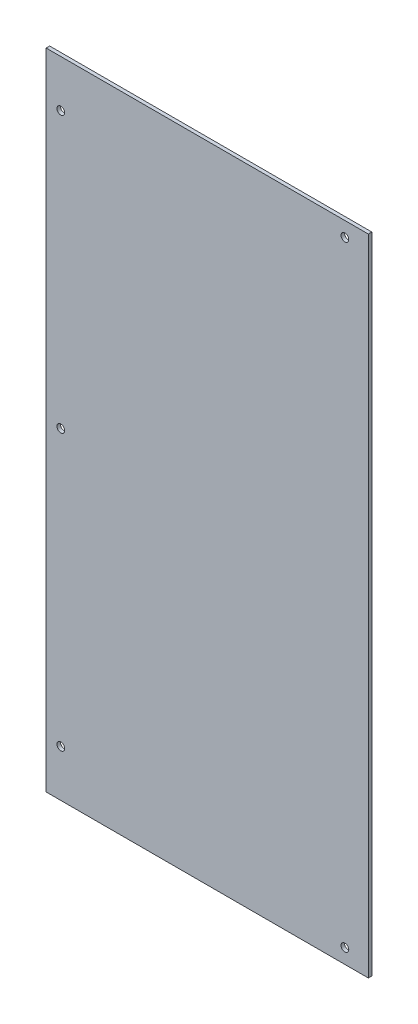
ISO-10303-21;
HEADER;
FILE_DESCRIPTION(('STEP AP214'),'2;1');
FILE_NAME('part.step','',(''),(''),'','','');
FILE_SCHEMA(('AUTOMOTIVE_DESIGN { 1 0 10303 214 1 1 1 1 }'));
ENDSEC;
DATA;
#1=APPLICATION_CONTEXT('core data for automotive mechanical design processes');
#2=APPLICATION_PROTOCOL_DEFINITION('international standard','automotive_design',2000,#1);
#3=PRODUCT_CONTEXT('',#1,'mechanical');
#4=PRODUCT('Part','Part','',(#3));
#5=PRODUCT_RELATED_PRODUCT_CATEGORY('part','',(#4));
#6=PRODUCT_DEFINITION_FORMATION('','',#4);
#7=PRODUCT_DEFINITION_CONTEXT('part definition',#1,'design');
#8=PRODUCT_DEFINITION('design','',#6,#7);
#9=PRODUCT_DEFINITION_SHAPE('','',#8);
#10=(LENGTH_UNIT() NAMED_UNIT(*) SI_UNIT(.MILLI.,.METRE.));
#11=(NAMED_UNIT(*) PLANE_ANGLE_UNIT() SI_UNIT($,.RADIAN.));
#12=(NAMED_UNIT(*) SI_UNIT($,.STERADIAN.) SOLID_ANGLE_UNIT());
#13=UNCERTAINTY_MEASURE_WITH_UNIT(LENGTH_MEASURE(1.E-05),#10,'distance_accuracy_value','');
#14=(GEOMETRIC_REPRESENTATION_CONTEXT(3) GLOBAL_UNCERTAINTY_ASSIGNED_CONTEXT((#13)) GLOBAL_UNIT_ASSIGNED_CONTEXT((#10,
#11,#12)) REPRESENTATION_CONTEXT('',''));
#15=CARTESIAN_POINT('',(0.,0.,0.));
#16=DIRECTION('',(0.,0.,1.));
#17=DIRECTION('',(1.,0.,0.));
#18=AXIS2_PLACEMENT_3D('',#15,#16,#17);
#19=CARTESIAN_POINT('',(0.,0.,3.));
#20=DIRECTION('',(1.,0.,0.));
#21=DIRECTION('',(0.,0.,-1.));
#22=AXIS2_PLACEMENT_3D('',#19,#20,#21);
#23=PLANE('',#22);
#24=DIRECTION('',(0.,-1.,0.));
#25=VECTOR('',#24,1.);
#26=CARTESIAN_POINT('',(0.,0.,0.));
#27=LINE('',#26,#25);
#28=CARTESIAN_POINT('',(0.,550.000000000019,0.));
#29=VERTEX_POINT('',#28);
#30=CARTESIAN_POINT('',(0.,0.,0.));
#31=VERTEX_POINT('',#30);
#32=EDGE_CURVE('E95',#29,#31,#27,.T.);
#33=ORIENTED_EDGE('',*,*,#32,.T.);
#34=DIRECTION('',(0.,0.,-1.));
#35=VECTOR('',#34,1.);
#36=CARTESIAN_POINT('',(0.,0.,3.));
#37=LINE('',#36,#35);
#38=CARTESIAN_POINT('',(0.,0.,3.));
#39=VERTEX_POINT('',#38);
#40=EDGE_CURVE('E11',#39,#31,#37,.T.);
#41=ORIENTED_EDGE('',*,*,#40,.F.);
#42=DIRECTION('',(0.,-1.,0.));
#43=VECTOR('',#42,1.);
#44=CARTESIAN_POINT('',(0.,0.,3.));
#45=LINE('',#44,#43);
#46=CARTESIAN_POINT('',(0.,550.000000000019,3.));
#47=VERTEX_POINT('',#46);
#48=EDGE_CURVE('E83',#47,#39,#45,.T.);
#49=ORIENTED_EDGE('',*,*,#48,.F.);
#50=DIRECTION('',(0.,0.,-1.));
#51=VECTOR('',#50,1.);
#52=CARTESIAN_POINT('',(0.,550.000000000019,3.));
#53=LINE('',#52,#51);
#54=EDGE_CURVE('E91',#47,#29,#53,.T.);
#55=ORIENTED_EDGE('',*,*,#54,.T.);
#56=EDGE_LOOP('',(#33,#41,#49,#55));
#57=FACE_BOUND('',#56,.T.);
#58=ADVANCED_FACE('F32',(#57),#23,.F.);
#59=CARTESIAN_POINT('',(0.,0.,3.));
#60=DIRECTION('',(0.,1.,0.));
#61=DIRECTION('',(0.,0.,1.));
#62=AXIS2_PLACEMENT_3D('',#59,#60,#61);
#63=PLANE('',#62);
#64=DIRECTION('',(1.,0.,0.));
#65=VECTOR('',#64,1.);
#66=CARTESIAN_POINT('',(0.,0.,0.));
#67=LINE('',#66,#65);
#68=CARTESIAN_POINT('',(275.,0.,0.));
#69=VERTEX_POINT('',#68);
#70=EDGE_CURVE('E87',#31,#69,#67,.T.);
#71=ORIENTED_EDGE('',*,*,#70,.T.);
#72=DIRECTION('',(0.,0.,-1.));
#73=VECTOR('',#72,1.);
#74=CARTESIAN_POINT('',(275.,0.,3.));
#75=LINE('',#74,#73);
#76=CARTESIAN_POINT('',(275.,0.,3.));
#77=VERTEX_POINT('',#76);
#78=EDGE_CURVE('E40',#77,#69,#75,.T.);
#79=ORIENTED_EDGE('',*,*,#78,.F.);
#80=DIRECTION('',(1.,0.,0.));
#81=VECTOR('',#80,1.);
#82=CARTESIAN_POINT('',(0.,0.,3.));
#83=LINE('',#82,#81);
#84=EDGE_CURVE('E78',#39,#77,#83,.T.);
#85=ORIENTED_EDGE('',*,*,#84,.F.);
#86=ORIENTED_EDGE('',*,*,#40,.T.);
#87=EDGE_LOOP('',(#71,#79,#85,#86));
#88=FACE_BOUND('',#87,.T.);
#89=ADVANCED_FACE('F86',(#88),#63,.F.);
#90=CARTESIAN_POINT('',(275.,0.,3.));
#91=DIRECTION('',(-1.,0.,0.));
#92=DIRECTION('',(0.,0.,1.));
#93=AXIS2_PLACEMENT_3D('',#90,#91,#92);
#94=PLANE('',#93);
#95=DIRECTION('',(0.,1.,0.));
#96=VECTOR('',#95,1.);
#97=CARTESIAN_POINT('',(275.,0.,0.));
#98=LINE('',#97,#96);
#99=CARTESIAN_POINT('',(275.,550.000000000019,0.));
#100=VERTEX_POINT('',#99);
#101=EDGE_CURVE('E65',#69,#100,#98,.T.);
#102=ORIENTED_EDGE('',*,*,#101,.T.);
#103=DIRECTION('',(0.,0.,-1.));
#104=VECTOR('',#103,1.);
#105=CARTESIAN_POINT('',(275.,550.000000000019,3.));
#106=LINE('',#105,#104);
#107=CARTESIAN_POINT('',(275.,550.000000000019,3.));
#108=VERTEX_POINT('',#107);
#109=EDGE_CURVE('E88',#108,#100,#106,.T.);
#110=ORIENTED_EDGE('',*,*,#109,.F.);
#111=DIRECTION('',(0.,1.,0.));
#112=VECTOR('',#111,1.);
#113=CARTESIAN_POINT('',(275.,0.,3.));
#114=LINE('',#113,#112);
#115=EDGE_CURVE('E81',#77,#108,#114,.T.);
#116=ORIENTED_EDGE('',*,*,#115,.F.);
#117=ORIENTED_EDGE('',*,*,#78,.T.);
#118=EDGE_LOOP('',(#102,#110,#116,#117));
#119=FACE_BOUND('',#118,.T.);
#120=ADVANCED_FACE('F89',(#119),#94,.F.);
#121=CARTESIAN_POINT('',(0.,550.000000000019,3.));
#122=DIRECTION('',(0.,-1.,0.));
#123=DIRECTION('',(0.,0.,-1.));
#124=AXIS2_PLACEMENT_3D('',#121,#122,#123);
#125=PLANE('',#124);
#126=DIRECTION('',(-1.,0.,0.));
#127=VECTOR('',#126,1.);
#128=CARTESIAN_POINT('',(0.,550.000000000019,0.));
#129=LINE('',#128,#127);
#130=EDGE_CURVE('E71',#100,#29,#129,.T.);
#131=ORIENTED_EDGE('',*,*,#130,.T.);
#132=ORIENTED_EDGE('',*,*,#54,.F.);
#133=DIRECTION('',(-1.,0.,0.));
#134=VECTOR('',#133,1.);
#135=CARTESIAN_POINT('',(0.,550.000000000019,3.));
#136=LINE('',#135,#134);
#137=EDGE_CURVE('E48',#108,#47,#136,.T.);
#138=ORIENTED_EDGE('',*,*,#137,.F.);
#139=ORIENTED_EDGE('',*,*,#109,.T.);
#140=EDGE_LOOP('',(#131,#132,#138,#139));
#141=FACE_BOUND('',#140,.T.);
#142=ADVANCED_FACE('F103',(#141),#125,.F.);
#143=CARTESIAN_POINT('',(0.,0.,3.));
#144=DIRECTION('',(0.,0.,-1.));
#145=DIRECTION('',(-1.,0.,0.));
#146=AXIS2_PLACEMENT_3D('',#143,#144,#145);
#147=PLANE('',#146);
#148=CARTESIAN_POINT('',(12.5,275.000000000009,3.));
#149=DIRECTION('',(0.,0.,1.));
#150=DIRECTION('',(1.,0.,0.));
#151=AXIS2_PLACEMENT_3D('',#148,#149,#150);
#152=CIRCLE('',#151,3.3);
#153=CARTESIAN_POINT('',(15.8,275.000000000009,3.));
#154=VERTEX_POINT('',#153);
#155=EDGE_CURVE('E135',#154,#154,#152,.T.);
#156=ORIENTED_EDGE('',*,*,#155,.F.);
#157=EDGE_LOOP('',(#156));
#158=FACE_BOUND('',#157,.T.);
#159=CARTESIAN_POINT('',(12.5,510.000000000019,3.));
#160=DIRECTION('',(0.,0.,1.));
#161=DIRECTION('',(1.,0.,0.));
#162=AXIS2_PLACEMENT_3D('',#159,#160,#161);
#163=CIRCLE('',#162,3.3);
#164=CARTESIAN_POINT('',(15.8,510.000000000019,3.));
#165=VERTEX_POINT('',#164);
#166=EDGE_CURVE('E129',#165,#165,#163,.T.);
#167=ORIENTED_EDGE('',*,*,#166,.F.);
#168=EDGE_LOOP('',(#167));
#169=FACE_BOUND('',#168,.T.);
#170=CARTESIAN_POINT('',(12.5,40.,3.));
#171=DIRECTION('',(0.,0.,1.));
#172=DIRECTION('',(1.,0.,0.));
#173=AXIS2_PLACEMENT_3D('',#170,#171,#172);
#174=CIRCLE('',#173,3.3);
#175=CARTESIAN_POINT('',(15.8,40.,3.));
#176=VERTEX_POINT('',#175);
#177=EDGE_CURVE('E123',#176,#176,#174,.T.);
#178=ORIENTED_EDGE('',*,*,#177,.F.);
#179=EDGE_LOOP('',(#178));
#180=FACE_BOUND('',#179,.T.);
#181=CARTESIAN_POINT('',(255.,12.5,3.));
#182=DIRECTION('',(0.,0.,1.));
#183=DIRECTION('',(1.,0.,0.));
#184=AXIS2_PLACEMENT_3D('',#181,#182,#183);
#185=CIRCLE('',#184,3.30000000000003);
#186=CARTESIAN_POINT('',(258.3,12.5,3.));
#187=VERTEX_POINT('',#186);
#188=EDGE_CURVE('E117',#187,#187,#185,.T.);
#189=ORIENTED_EDGE('',*,*,#188,.F.);
#190=EDGE_LOOP('',(#189));
#191=FACE_BOUND('',#190,.T.);
#192=CARTESIAN_POINT('',(255.,537.500000000019,3.));
#193=DIRECTION('',(0.,0.,1.));
#194=DIRECTION('',(1.,0.,0.));
#195=AXIS2_PLACEMENT_3D('',#192,#193,#194);
#196=CIRCLE('',#195,3.30000000000003);
#197=CARTESIAN_POINT('',(258.3,537.500000000019,3.));
#198=VERTEX_POINT('',#197);
#199=EDGE_CURVE('E111',#198,#198,#196,.T.);
#200=ORIENTED_EDGE('',*,*,#199,.F.);
#201=EDGE_LOOP('',(#200));
#202=FACE_BOUND('',#201,.T.);
#203=ORIENTED_EDGE('',*,*,#48,.T.);
#204=ORIENTED_EDGE('',*,*,#84,.T.);
#205=ORIENTED_EDGE('',*,*,#115,.T.);
#206=ORIENTED_EDGE('',*,*,#137,.T.);
#207=EDGE_LOOP('',(#203,#204,#205,#206));
#208=FACE_BOUND('',#207,.T.);
#209=ADVANCED_FACE('F79',(#158,#169,#180,#191,#202,#208),#147,.F.);
#210=CARTESIAN_POINT('',(0.,0.,0.));
#211=DIRECTION('',(0.,0.,-1.));
#212=DIRECTION('',(-1.,0.,0.));
#213=AXIS2_PLACEMENT_3D('',#210,#211,#212);
#214=PLANE('',#213);
#215=CARTESIAN_POINT('',(12.5,275.000000000009,0.));
#216=DIRECTION('',(0.,0.,1.));
#217=DIRECTION('',(1.,0.,0.));
#218=AXIS2_PLACEMENT_3D('',#215,#216,#217);
#219=CIRCLE('',#218,3.3);
#220=CARTESIAN_POINT('',(15.8,275.000000000009,0.));
#221=VERTEX_POINT('',#220);
#222=EDGE_CURVE('E132',#221,#221,#219,.T.);
#223=ORIENTED_EDGE('',*,*,#222,.T.);
#224=EDGE_LOOP('',(#223));
#225=FACE_BOUND('',#224,.T.);
#226=CARTESIAN_POINT('',(12.5,510.000000000019,0.));
#227=DIRECTION('',(0.,0.,1.));
#228=DIRECTION('',(1.,0.,0.));
#229=AXIS2_PLACEMENT_3D('',#226,#227,#228);
#230=CIRCLE('',#229,3.3);
#231=CARTESIAN_POINT('',(15.8,510.000000000019,0.));
#232=VERTEX_POINT('',#231);
#233=EDGE_CURVE('E126',#232,#232,#230,.T.);
#234=ORIENTED_EDGE('',*,*,#233,.T.);
#235=EDGE_LOOP('',(#234));
#236=FACE_BOUND('',#235,.T.);
#237=CARTESIAN_POINT('',(12.5,40.,0.));
#238=DIRECTION('',(0.,0.,1.));
#239=DIRECTION('',(1.,0.,0.));
#240=AXIS2_PLACEMENT_3D('',#237,#238,#239);
#241=CIRCLE('',#240,3.3);
#242=CARTESIAN_POINT('',(15.8,40.,0.));
#243=VERTEX_POINT('',#242);
#244=EDGE_CURVE('E120',#243,#243,#241,.T.);
#245=ORIENTED_EDGE('',*,*,#244,.T.);
#246=EDGE_LOOP('',(#245));
#247=FACE_BOUND('',#246,.T.);
#248=CARTESIAN_POINT('',(255.,12.5,0.));
#249=DIRECTION('',(0.,0.,1.));
#250=DIRECTION('',(1.,0.,0.));
#251=AXIS2_PLACEMENT_3D('',#248,#249,#250);
#252=CIRCLE('',#251,3.30000000000003);
#253=CARTESIAN_POINT('',(258.3,12.5,0.));
#254=VERTEX_POINT('',#253);
#255=EDGE_CURVE('E114',#254,#254,#252,.T.);
#256=ORIENTED_EDGE('',*,*,#255,.T.);
#257=EDGE_LOOP('',(#256));
#258=FACE_BOUND('',#257,.T.);
#259=CARTESIAN_POINT('',(255.,537.500000000019,0.));
#260=DIRECTION('',(0.,0.,1.));
#261=DIRECTION('',(1.,0.,0.));
#262=AXIS2_PLACEMENT_3D('',#259,#260,#261);
#263=CIRCLE('',#262,3.30000000000003);
#264=CARTESIAN_POINT('',(258.3,537.500000000019,0.));
#265=VERTEX_POINT('',#264);
#266=EDGE_CURVE('E98',#265,#265,#263,.T.);
#267=ORIENTED_EDGE('',*,*,#266,.T.);
#268=EDGE_LOOP('',(#267));
#269=FACE_BOUND('',#268,.T.);
#270=ORIENTED_EDGE('',*,*,#32,.F.);
#271=ORIENTED_EDGE('',*,*,#130,.F.);
#272=ORIENTED_EDGE('',*,*,#101,.F.);
#273=ORIENTED_EDGE('',*,*,#70,.F.);
#274=EDGE_LOOP('',(#270,#271,#272,#273));
#275=FACE_BOUND('',#274,.T.);
#276=ADVANCED_FACE('F106',(#225,#236,#247,#258,#269,#275),#214,.T.);
#277=CARTESIAN_POINT('',(255.,537.500000000019,3.));
#278=DIRECTION('',(0.,0.,1.));
#279=DIRECTION('',(1.,0.,0.));
#280=AXIS2_PLACEMENT_3D('',#277,#278,#279);
#281=CYLINDRICAL_SURFACE('',#280,3.30000000000003);
#282=ORIENTED_EDGE('',*,*,#266,.F.);
#283=EDGE_LOOP('',(#282));
#284=FACE_BOUND('',#283,.T.);
#285=ORIENTED_EDGE('',*,*,#199,.T.);
#286=EDGE_LOOP('',(#285));
#287=FACE_BOUND('',#286,.T.);
#288=ADVANCED_FACE('F152',(#284,#287),#281,.F.);
#289=CARTESIAN_POINT('',(255.,12.5,3.));
#290=DIRECTION('',(0.,0.,1.));
#291=DIRECTION('',(1.,0.,0.));
#292=AXIS2_PLACEMENT_3D('',#289,#290,#291);
#293=CYLINDRICAL_SURFACE('',#292,3.30000000000003);
#294=ORIENTED_EDGE('',*,*,#255,.F.);
#295=EDGE_LOOP('',(#294));
#296=FACE_BOUND('',#295,.T.);
#297=ORIENTED_EDGE('',*,*,#188,.T.);
#298=EDGE_LOOP('',(#297));
#299=FACE_BOUND('',#298,.T.);
#300=ADVANCED_FACE('F154',(#296,#299),#293,.F.);
#301=CARTESIAN_POINT('',(12.5,40.,3.));
#302=DIRECTION('',(0.,0.,1.));
#303=DIRECTION('',(1.,0.,0.));
#304=AXIS2_PLACEMENT_3D('',#301,#302,#303);
#305=CYLINDRICAL_SURFACE('',#304,3.3);
#306=ORIENTED_EDGE('',*,*,#244,.F.);
#307=EDGE_LOOP('',(#306));
#308=FACE_BOUND('',#307,.T.);
#309=ORIENTED_EDGE('',*,*,#177,.T.);
#310=EDGE_LOOP('',(#309));
#311=FACE_BOUND('',#310,.T.);
#312=ADVANCED_FACE('F161',(#308,#311),#305,.F.);
#313=CARTESIAN_POINT('',(12.5,510.000000000019,3.));
#314=DIRECTION('',(0.,0.,1.));
#315=DIRECTION('',(1.,0.,0.));
#316=AXIS2_PLACEMENT_3D('',#313,#314,#315);
#317=CYLINDRICAL_SURFACE('',#316,3.3);
#318=ORIENTED_EDGE('',*,*,#233,.F.);
#319=EDGE_LOOP('',(#318));
#320=FACE_BOUND('',#319,.T.);
#321=ORIENTED_EDGE('',*,*,#166,.T.);
#322=EDGE_LOOP('',(#321));
#323=FACE_BOUND('',#322,.T.);
#324=ADVANCED_FACE('F208',(#320,#323),#317,.F.);
#325=CARTESIAN_POINT('',(12.5,275.000000000009,3.));
#326=DIRECTION('',(0.,0.,1.));
#327=DIRECTION('',(1.,0.,0.));
#328=AXIS2_PLACEMENT_3D('',#325,#326,#327);
#329=CYLINDRICAL_SURFACE('',#328,3.3);
#330=ORIENTED_EDGE('',*,*,#222,.F.);
#331=EDGE_LOOP('',(#330));
#332=FACE_BOUND('',#331,.T.);
#333=ORIENTED_EDGE('',*,*,#155,.T.);
#334=EDGE_LOOP('',(#333));
#335=FACE_BOUND('',#334,.T.);
#336=ADVANCED_FACE('F139',(#332,#335),#329,.F.);
#337=CLOSED_SHELL('',(#58,#89,#120,#142,#209,#276,#288,#300,#312,#324,#336));
#338=MANIFOLD_SOLID_BREP('B2',#337);
#339=ADVANCED_BREP_SHAPE_REPRESENTATION('',(#18,#338),#14);
#340=SHAPE_DEFINITION_REPRESENTATION(#9,#339);
ENDSEC;
END-ISO-10303-21;
